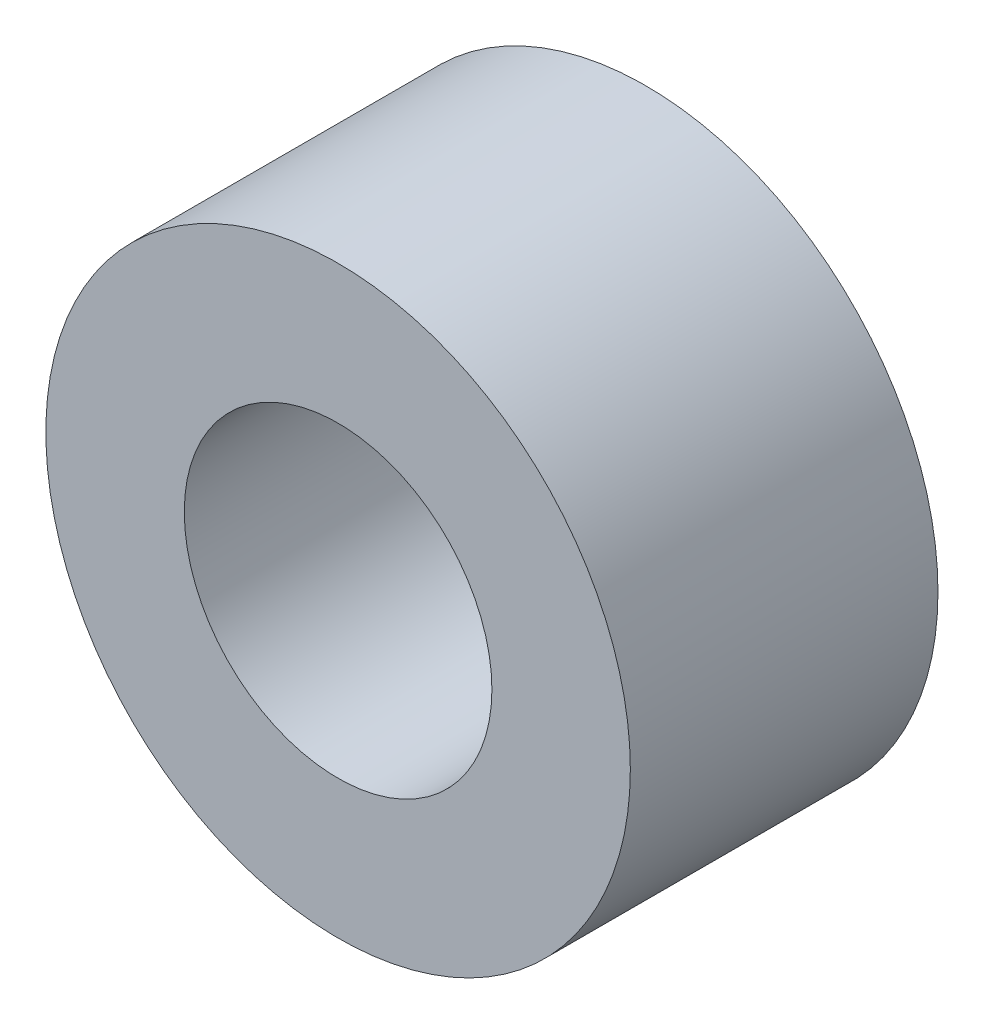
ISO-10303-21;
HEADER;
FILE_DESCRIPTION(('STEP AP214'),'2;1');
FILE_NAME('part.step','',(''),(''),'','','');
FILE_SCHEMA(('AUTOMOTIVE_DESIGN { 1 0 10303 214 1 1 1 1 }'));
ENDSEC;
DATA;
#1=APPLICATION_CONTEXT('core data for automotive mechanical design processes');
#2=APPLICATION_PROTOCOL_DEFINITION('international standard','automotive_design',2000,#1);
#3=PRODUCT_CONTEXT('',#1,'mechanical');
#4=PRODUCT('Part','Part','',(#3));
#5=PRODUCT_RELATED_PRODUCT_CATEGORY('part','',(#4));
#6=PRODUCT_DEFINITION_FORMATION('','',#4);
#7=PRODUCT_DEFINITION_CONTEXT('part definition',#1,'design');
#8=PRODUCT_DEFINITION('design','',#6,#7);
#9=PRODUCT_DEFINITION_SHAPE('','',#8);
#10=(LENGTH_UNIT() NAMED_UNIT(*) SI_UNIT(.MILLI.,.METRE.));
#11=(NAMED_UNIT(*) PLANE_ANGLE_UNIT() SI_UNIT($,.RADIAN.));
#12=(NAMED_UNIT(*) SI_UNIT($,.STERADIAN.) SOLID_ANGLE_UNIT());
#13=UNCERTAINTY_MEASURE_WITH_UNIT(LENGTH_MEASURE(1.E-05),#10,'distance_accuracy_value','');
#14=(GEOMETRIC_REPRESENTATION_CONTEXT(3) GLOBAL_UNCERTAINTY_ASSIGNED_CONTEXT((#13)) GLOBAL_UNIT_ASSIGNED_CONTEXT((#10,
#11,#12)) REPRESENTATION_CONTEXT('',''));
#15=CARTESIAN_POINT('',(0.,0.,0.));
#16=DIRECTION('',(0.,0.,1.));
#17=DIRECTION('',(1.,0.,0.));
#18=AXIS2_PLACEMENT_3D('',#15,#16,#17);
#19=CARTESIAN_POINT('',(0.,0.,0.));
#20=DIRECTION('',(0.,0.,1.));
#21=DIRECTION('',(1.,0.,0.));
#22=AXIS2_PLACEMENT_3D('',#19,#20,#21);
#23=PLANE('',#22);
#24=CARTESIAN_POINT('',(0.,0.,0.));
#25=DIRECTION('',(0.,0.,1.));
#26=DIRECTION('',(1.,0.,0.));
#27=AXIS2_PLACEMENT_3D('',#24,#25,#26);
#28=CIRCLE('',#27,2.5);
#29=CARTESIAN_POINT('',(2.5,0.,0.));
#30=VERTEX_POINT('',#29);
#31=EDGE_CURVE('E70',#30,#30,#28,.T.);
#32=ORIENTED_EDGE('',*,*,#31,.T.);
#33=EDGE_LOOP('',(#32));
#34=FACE_BOUND('',#33,.T.);
#35=CARTESIAN_POINT('',(0.,0.,0.));
#36=DIRECTION('',(0.,0.,1.));
#37=DIRECTION('',(1.,0.,0.));
#38=AXIS2_PLACEMENT_3D('',#35,#36,#37);
#39=CIRCLE('',#38,4.75);
#40=CARTESIAN_POINT('',(4.75,0.,0.));
#41=VERTEX_POINT('',#40);
#42=EDGE_CURVE('E61',#41,#41,#39,.T.);
#43=ORIENTED_EDGE('',*,*,#42,.F.);
#44=EDGE_LOOP('',(#43));
#45=FACE_BOUND('',#44,.T.);
#46=ADVANCED_FACE('F57',(#34,#45),#23,.F.);
#47=CARTESIAN_POINT('',(0.,0.,5.));
#48=DIRECTION('',(0.,0.,-1.));
#49=DIRECTION('',(-1.,0.,0.));
#50=AXIS2_PLACEMENT_3D('',#47,#48,#49);
#51=CYLINDRICAL_SURFACE('',#50,4.75);
#52=CARTESIAN_POINT('',(0.,0.,5.));
#53=DIRECTION('',(0.,0.,1.));
#54=DIRECTION('',(1.,0.,0.));
#55=AXIS2_PLACEMENT_3D('',#52,#53,#54);
#56=CIRCLE('',#55,4.75);
#57=CARTESIAN_POINT('',(4.75,0.,5.));
#58=VERTEX_POINT('',#57);
#59=EDGE_CURVE('E11',#58,#58,#56,.T.);
#60=ORIENTED_EDGE('',*,*,#59,.F.);
#61=EDGE_LOOP('',(#60));
#62=FACE_BOUND('',#61,.T.);
#63=ORIENTED_EDGE('',*,*,#42,.T.);
#64=EDGE_LOOP('',(#63));
#65=FACE_BOUND('',#64,.T.);
#66=ADVANCED_FACE('F59',(#62,#65),#51,.T.);
#67=CARTESIAN_POINT('',(0.,0.,5.));
#68=DIRECTION('',(0.,0.,1.));
#69=DIRECTION('',(1.,0.,0.));
#70=AXIS2_PLACEMENT_3D('',#67,#68,#69);
#71=PLANE('',#70);
#72=CARTESIAN_POINT('',(0.,0.,5.));
#73=DIRECTION('',(0.,0.,1.));
#74=DIRECTION('',(1.,0.,0.));
#75=AXIS2_PLACEMENT_3D('',#72,#73,#74);
#76=CIRCLE('',#75,2.5);
#77=CARTESIAN_POINT('',(2.5,0.,5.));
#78=VERTEX_POINT('',#77);
#79=EDGE_CURVE('E72',#78,#78,#76,.T.);
#80=ORIENTED_EDGE('',*,*,#79,.F.);
#81=EDGE_LOOP('',(#80));
#82=FACE_BOUND('',#81,.T.);
#83=ORIENTED_EDGE('',*,*,#59,.T.);
#84=EDGE_LOOP('',(#83));
#85=FACE_BOUND('',#84,.T.);
#86=ADVANCED_FACE('F85',(#82,#85),#71,.T.);
#87=CARTESIAN_POINT('',(0.,0.,0.));
#88=DIRECTION('',(0.,0.,1.));
#89=DIRECTION('',(1.,0.,0.));
#90=AXIS2_PLACEMENT_3D('',#87,#88,#89);
#91=CYLINDRICAL_SURFACE('',#90,2.5);
#92=ORIENTED_EDGE('',*,*,#31,.F.);
#93=EDGE_LOOP('',(#92));
#94=FACE_BOUND('',#93,.T.);
#95=ORIENTED_EDGE('',*,*,#79,.T.);
#96=EDGE_LOOP('',(#95));
#97=FACE_BOUND('',#96,.T.);
#98=ADVANCED_FACE('F82',(#94,#97),#91,.F.);
#99=CLOSED_SHELL('',(#46,#66,#86,#98));
#100=MANIFOLD_SOLID_BREP('B2',#99);
#101=ADVANCED_BREP_SHAPE_REPRESENTATION('',(#18,#100),#14);
#102=SHAPE_DEFINITION_REPRESENTATION(#9,#101);
ENDSEC;
END-ISO-10303-21;
